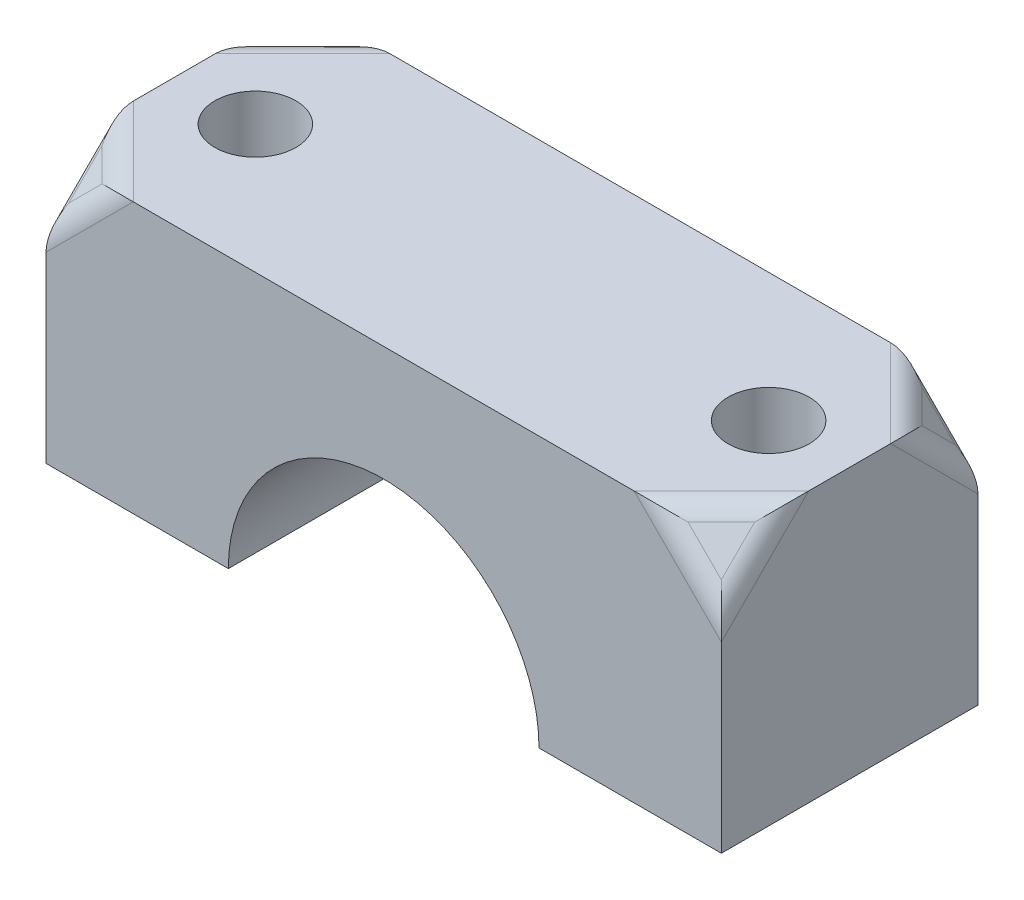
ISO-10303-21;
HEADER;
FILE_DESCRIPTION(('STEP AP214'),'2;1');
FILE_NAME('part.step','',(''),(''),'','','');
FILE_SCHEMA(('AUTOMOTIVE_DESIGN { 1 0 10303 214 1 1 1 1 }'));
ENDSEC;
DATA;
#1=APPLICATION_CONTEXT('core data for automotive mechanical design processes');
#2=APPLICATION_PROTOCOL_DEFINITION('international standard','automotive_design',2000,#1);
#3=PRODUCT_CONTEXT('',#1,'mechanical');
#4=PRODUCT('Part','Part','',(#3));
#5=PRODUCT_RELATED_PRODUCT_CATEGORY('part','',(#4));
#6=PRODUCT_DEFINITION_FORMATION('','',#4);
#7=PRODUCT_DEFINITION_CONTEXT('part definition',#1,'design');
#8=PRODUCT_DEFINITION('design','',#6,#7);
#9=PRODUCT_DEFINITION_SHAPE('','',#8);
#10=(LENGTH_UNIT() NAMED_UNIT(*) SI_UNIT(.MILLI.,.METRE.));
#11=(NAMED_UNIT(*) PLANE_ANGLE_UNIT() SI_UNIT($,.RADIAN.));
#12=(NAMED_UNIT(*) SI_UNIT($,.STERADIAN.) SOLID_ANGLE_UNIT());
#13=UNCERTAINTY_MEASURE_WITH_UNIT(LENGTH_MEASURE(1.E-05),#10,'distance_accuracy_value','');
#14=(GEOMETRIC_REPRESENTATION_CONTEXT(3) GLOBAL_UNCERTAINTY_ASSIGNED_CONTEXT((#13)) GLOBAL_UNIT_ASSIGNED_CONTEXT((#10,
#11,#12)) REPRESENTATION_CONTEXT('',''));
#15=CARTESIAN_POINT('',(0.,0.,0.));
#16=DIRECTION('',(0.,0.,1.));
#17=DIRECTION('',(1.,0.,0.));
#18=AXIS2_PLACEMENT_3D('',#15,#16,#17);
#19=CARTESIAN_POINT('',(0.,20.,19.));
#20=DIRECTION('',(0.,1.,0.));
#21=DIRECTION('',(0.,0.,1.));
#22=AXIS2_PLACEMENT_3D('',#19,#20,#21);
#23=PLANE('',#22);
#24=CARTESIAN_POINT('',(-19.,20.,9.50000000000001));
#25=DIRECTION('',(0.,1.,0.));
#26=DIRECTION('',(0.,0.,1.));
#27=AXIS2_PLACEMENT_3D('',#24,#25,#26);
#28=CIRCLE('',#27,3.);
#29=CARTESIAN_POINT('',(-19.,20.,12.5));
#30=VERTEX_POINT('',#29);
#31=EDGE_CURVE('E631',#30,#30,#28,.T.);
#32=ORIENTED_EDGE('',*,*,#31,.F.);
#33=EDGE_LOOP('',(#32));
#34=FACE_BOUND('',#33,.T.);
#35=CARTESIAN_POINT('',(19.,20.,9.49999999999999));
#36=DIRECTION('',(0.,1.,0.));
#37=DIRECTION('',(0.,0.,1.));
#38=AXIS2_PLACEMENT_3D('',#35,#36,#37);
#39=CIRCLE('',#38,3.);
#40=CARTESIAN_POINT('',(19.,20.,12.5));
#41=VERTEX_POINT('',#40);
#42=EDGE_CURVE('E329',#41,#41,#39,.T.);
#43=ORIENTED_EDGE('',*,*,#42,.F.);
#44=EDGE_LOOP('',(#43));
#45=FACE_BOUND('',#44,.T.);
#46=DIRECTION('',(0.,0.,-1.));
#47=VECTOR('',#46,1.);
#48=CARTESIAN_POINT('',(25.,20.,19.));
#49=LINE('',#48,#47);
#50=CARTESIAN_POINT('',(25.,20.,12.5358983848622));
#51=VERTEX_POINT('',#50);
#52=CARTESIAN_POINT('',(25.,20.,6.46410161513775));
#53=VERTEX_POINT('',#52);
#54=EDGE_CURVE('E239',#51,#53,#49,.T.);
#55=ORIENTED_EDGE('',*,*,#54,.T.);
#56=DIRECTION('',(-0.707106781186548,0.,-0.707106781186547));
#57=VECTOR('',#56,1.);
#58=CARTESIAN_POINT('',(18.7679491924311,20.,0.232050807568867));
#59=LINE('',#58,#57);
#60=CARTESIAN_POINT('',(18.5358983848623,20.,0.));
#61=VERTEX_POINT('',#60);
#62=EDGE_CURVE('E278',#53,#61,#59,.T.);
#63=ORIENTED_EDGE('',*,*,#62,.T.);
#64=DIRECTION('',(1.,0.,0.));
#65=VECTOR('',#64,1.);
#66=CARTESIAN_POINT('',(0.,20.,0.));
#67=LINE('',#66,#65);
#68=CARTESIAN_POINT('',(-18.5358983848623,20.,0.));
#69=VERTEX_POINT('',#68);
#70=EDGE_CURVE('E223',#69,#61,#67,.T.);
#71=ORIENTED_EDGE('',*,*,#70,.F.);
#72=DIRECTION('',(-0.707106781186548,0.,0.707106781186547));
#73=VECTOR('',#72,1.);
#74=CARTESIAN_POINT('',(-18.7679491924311,20.,0.23205080756887));
#75=LINE('',#74,#73);
#76=CARTESIAN_POINT('',(-25.,20.,6.46410161513775));
#77=VERTEX_POINT('',#76);
#78=EDGE_CURVE('E272',#69,#77,#75,.T.);
#79=ORIENTED_EDGE('',*,*,#78,.T.);
#80=DIRECTION('',(0.,0.,-1.));
#81=VECTOR('',#80,1.);
#82=CARTESIAN_POINT('',(-25.,20.,19.));
#83=LINE('',#82,#81);
#84=CARTESIAN_POINT('',(-25.,20.,12.5358983848622));
#85=VERTEX_POINT('',#84);
#86=EDGE_CURVE('E235',#85,#77,#83,.T.);
#87=ORIENTED_EDGE('',*,*,#86,.F.);
#88=DIRECTION('',(0.707106781186548,0.,0.707106781186548));
#89=VECTOR('',#88,1.);
#90=CARTESIAN_POINT('',(-9.26794919243112,20.,28.2679491924311));
#91=LINE('',#90,#89);
#92=CARTESIAN_POINT('',(-18.5358983848622,20.,19.));
#93=VERTEX_POINT('',#92);
#94=EDGE_CURVE('E269',#85,#93,#91,.T.);
#95=ORIENTED_EDGE('',*,*,#94,.T.);
#96=DIRECTION('',(1.,0.,0.));
#97=VECTOR('',#96,1.);
#98=CARTESIAN_POINT('',(0.,20.,19.));
#99=LINE('',#98,#97);
#100=CARTESIAN_POINT('',(18.5358983848622,20.,19.));
#101=VERTEX_POINT('',#100);
#102=EDGE_CURVE('E202',#93,#101,#99,.T.);
#103=ORIENTED_EDGE('',*,*,#102,.T.);
#104=DIRECTION('',(0.707106781186548,0.,-0.707106781186548));
#105=VECTOR('',#104,1.);
#106=CARTESIAN_POINT('',(9.26794919243112,20.,28.2679491924311));
#107=LINE('',#106,#105);
#108=EDGE_CURVE('E275',#101,#51,#107,.T.);
#109=ORIENTED_EDGE('',*,*,#108,.T.);
#110=EDGE_LOOP('',(#55,#63,#71,#79,#87,#95,#103,#109));
#111=FACE_BOUND('',#110,.T.);
#112=ADVANCED_FACE('F47',(#34,#45,#111),#23,.T.);
#113=CARTESIAN_POINT('',(0.,0.,19.));
#114=DIRECTION('',(0.,0.,1.));
#115=DIRECTION('',(1.,0.,0.));
#116=AXIS2_PLACEMENT_3D('',#113,#114,#115);
#117=PLANE('',#116);
#118=DIRECTION('',(0.,1.,0.));
#119=VECTOR('',#118,1.);
#120=CARTESIAN_POINT('',(25.,0.,19.));
#121=LINE('',#120,#119);
#122=CARTESIAN_POINT('',(25.,0.,19.));
#123=VERTEX_POINT('',#122);
#124=CARTESIAN_POINT('',(25.,13.5358983848622,19.));
#125=VERTEX_POINT('',#124);
#126=EDGE_CURVE('E182',#123,#125,#121,.T.);
#127=ORIENTED_EDGE('',*,*,#126,.T.);
#128=DIRECTION('',(-0.707106781186548,0.707106781186548,0.));
#129=VECTOR('',#128,1.);
#130=CARTESIAN_POINT('',(19.2679491924311,19.2679491924311,19.));
#131=LINE('',#130,#129);
#132=EDGE_CURVE('E295',#125,#101,#131,.T.);
#133=ORIENTED_EDGE('',*,*,#132,.T.);
#134=ORIENTED_EDGE('',*,*,#102,.F.);
#135=DIRECTION('',(-0.707106781186548,-0.707106781186548,0.));
#136=VECTOR('',#135,1.);
#137=CARTESIAN_POINT('',(-19.2679491924311,19.2679491924311,19.));
#138=LINE('',#137,#136);
#139=CARTESIAN_POINT('',(-25.,13.5358983848622,19.));
#140=VERTEX_POINT('',#139);
#141=EDGE_CURVE('E291',#93,#140,#138,.T.);
#142=ORIENTED_EDGE('',*,*,#141,.T.);
#143=DIRECTION('',(0.,1.,0.));
#144=VECTOR('',#143,1.);
#145=CARTESIAN_POINT('',(-25.,0.,19.));
#146=LINE('',#145,#144);
#147=CARTESIAN_POINT('',(-25.,0.,19.));
#148=VERTEX_POINT('',#147);
#149=EDGE_CURVE('E206',#148,#140,#146,.T.);
#150=ORIENTED_EDGE('',*,*,#149,.F.);
#151=DIRECTION('',(1.,0.,0.));
#152=VECTOR('',#151,1.);
#153=CARTESIAN_POINT('',(0.,0.,19.));
#154=LINE('',#153,#152);
#155=CARTESIAN_POINT('',(-11.5,0.,19.));
#156=VERTEX_POINT('',#155);
#157=EDGE_CURVE('E187',#148,#156,#154,.T.);
#158=ORIENTED_EDGE('',*,*,#157,.T.);
#159=CARTESIAN_POINT('',(0.,0.,19.));
#160=DIRECTION('',(0.,0.,1.));
#161=DIRECTION('',(1.,0.,0.));
#162=AXIS2_PLACEMENT_3D('',#159,#160,#161);
#163=CIRCLE('',#162,11.5);
#164=CARTESIAN_POINT('',(11.5,0.,19.));
#165=VERTEX_POINT('',#164);
#166=EDGE_CURVE('E165',#165,#156,#163,.T.);
#167=ORIENTED_EDGE('',*,*,#166,.F.);
#168=DIRECTION('',(1.,0.,0.));
#169=VECTOR('',#168,1.);
#170=CARTESIAN_POINT('',(0.,0.,19.));
#171=LINE('',#170,#169);
#172=EDGE_CURVE('E175',#165,#123,#171,.T.);
#173=ORIENTED_EDGE('',*,*,#172,.T.);
#174=EDGE_LOOP('',(#127,#133,#134,#142,#150,#158,#167,#173));
#175=FACE_BOUND('',#174,.T.);
#176=ADVANCED_FACE('F184',(#175),#117,.T.);
#177=CARTESIAN_POINT('',(-25.,0.,19.));
#178=DIRECTION('',(-1.,0.,0.));
#179=DIRECTION('',(0.,0.,1.));
#180=AXIS2_PLACEMENT_3D('',#177,#178,#179);
#181=PLANE('',#180);
#182=ORIENTED_EDGE('',*,*,#86,.T.);
#183=DIRECTION('',(0.,-0.707106781186548,-0.707106781186547));
#184=VECTOR('',#183,1.);
#185=CARTESIAN_POINT('',(-25.,16.2679491924311,2.73205080756887));
#186=LINE('',#185,#184);
#187=CARTESIAN_POINT('',(-25.,13.5358983848623,0.));
#188=VERTEX_POINT('',#187);
#189=EDGE_CURVE('E311',#77,#188,#186,.T.);
#190=ORIENTED_EDGE('',*,*,#189,.T.);
#191=DIRECTION('',(0.,1.,0.));
#192=VECTOR('',#191,1.);
#193=CARTESIAN_POINT('',(-25.,0.,0.));
#194=LINE('',#193,#192);
#195=CARTESIAN_POINT('',(-25.,0.,0.));
#196=VERTEX_POINT('',#195);
#197=EDGE_CURVE('E194',#196,#188,#194,.T.);
#198=ORIENTED_EDGE('',*,*,#197,.F.);
#199=DIRECTION('',(0.,0.,-1.));
#200=VECTOR('',#199,1.);
#201=CARTESIAN_POINT('',(-25.,0.,19.));
#202=LINE('',#201,#200);
#203=EDGE_CURVE('E232',#148,#196,#202,.T.);
#204=ORIENTED_EDGE('',*,*,#203,.F.);
#205=ORIENTED_EDGE('',*,*,#149,.T.);
#206=DIRECTION('',(0.,0.707106781186548,-0.707106781186548));
#207=VECTOR('',#206,1.);
#208=CARTESIAN_POINT('',(-25.,6.76794919243112,25.7679491924311));
#209=LINE('',#208,#207);
#210=EDGE_CURVE('E308',#140,#85,#209,.T.);
#211=ORIENTED_EDGE('',*,*,#210,.T.);
#212=EDGE_LOOP('',(#182,#190,#198,#204,#205,#211));
#213=FACE_BOUND('',#212,.T.);
#214=ADVANCED_FACE('F408',(#213),#181,.T.);
#215=CARTESIAN_POINT('',(0.,0.,19.));
#216=DIRECTION('',(0.,0.,-1.));
#217=DIRECTION('',(-1.,0.,0.));
#218=AXIS2_PLACEMENT_3D('',#215,#216,#217);
#219=CYLINDRICAL_SURFACE('',#218,11.5);
#220=CARTESIAN_POINT('',(0.,0.,0.));
#221=DIRECTION('',(0.,0.,1.));
#222=DIRECTION('',(1.,0.,0.));
#223=AXIS2_PLACEMENT_3D('',#220,#221,#222);
#224=CIRCLE('',#223,11.5);
#225=CARTESIAN_POINT('',(11.5,0.,0.));
#226=VERTEX_POINT('',#225);
#227=CARTESIAN_POINT('',(-11.5,0.,0.));
#228=VERTEX_POINT('',#227);
#229=EDGE_CURVE('E167',#226,#228,#224,.T.);
#230=ORIENTED_EDGE('',*,*,#229,.F.);
#231=DIRECTION('',(0.,0.,-1.));
#232=VECTOR('',#231,1.);
#233=CARTESIAN_POINT('',(11.5,0.,19.));
#234=LINE('',#233,#232);
#235=EDGE_CURVE('E161',#165,#226,#234,.T.);
#236=ORIENTED_EDGE('',*,*,#235,.F.);
#237=ORIENTED_EDGE('',*,*,#166,.T.);
#238=DIRECTION('',(0.,0.,-1.));
#239=VECTOR('',#238,1.);
#240=CARTESIAN_POINT('',(-11.5,0.,19.));
#241=LINE('',#240,#239);
#242=EDGE_CURVE('E212',#156,#228,#241,.T.);
#243=ORIENTED_EDGE('',*,*,#242,.T.);
#244=EDGE_LOOP('',(#230,#236,#237,#243));
#245=FACE_BOUND('',#244,.T.);
#246=ADVANCED_FACE('F163',(#245),#219,.F.);
#247=CARTESIAN_POINT('',(0.,0.,19.));
#248=DIRECTION('',(0.,1.,0.));
#249=DIRECTION('',(-1.,0.,0.));
#250=AXIS2_PLACEMENT_3D('',#247,#248,#249);
#251=PLANE('',#250);
#252=CARTESIAN_POINT('',(19.,0.,9.49999999999999));
#253=DIRECTION('',(0.,1.,0.));
#254=DIRECTION('',(0.,0.,1.));
#255=AXIS2_PLACEMENT_3D('',#252,#253,#254);
#256=CIRCLE('',#255,3.);
#257=CARTESIAN_POINT('',(19.,0.,12.5));
#258=VERTEX_POINT('',#257);
#259=EDGE_CURVE('E197',#258,#258,#256,.F.);
#260=ORIENTED_EDGE('',*,*,#259,.F.);
#261=EDGE_LOOP('',(#260));
#262=FACE_BOUND('',#261,.T.);
#263=DIRECTION('',(1.,0.,0.));
#264=VECTOR('',#263,1.);
#265=CARTESIAN_POINT('',(0.,0.,0.));
#266=LINE('',#265,#264);
#267=CARTESIAN_POINT('',(25.,0.,0.));
#268=VERTEX_POINT('',#267);
#269=EDGE_CURVE('E215',#226,#268,#266,.T.);
#270=ORIENTED_EDGE('',*,*,#269,.T.);
#271=DIRECTION('',(0.,0.,-1.));
#272=VECTOR('',#271,1.);
#273=CARTESIAN_POINT('',(25.,0.,19.));
#274=LINE('',#273,#272);
#275=EDGE_CURVE('E172',#123,#268,#274,.T.);
#276=ORIENTED_EDGE('',*,*,#275,.F.);
#277=ORIENTED_EDGE('',*,*,#172,.F.);
#278=ORIENTED_EDGE('',*,*,#235,.T.);
#279=EDGE_LOOP('',(#270,#276,#277,#278));
#280=FACE_BOUND('',#279,.T.);
#281=ADVANCED_FACE('F176',(#262,#280),#251,.F.);
#282=CARTESIAN_POINT('',(25.,0.,19.));
#283=DIRECTION('',(-1.,0.,0.));
#284=DIRECTION('',(0.,0.,1.));
#285=AXIS2_PLACEMENT_3D('',#282,#283,#284);
#286=PLANE('',#285);
#287=DIRECTION('',(0.,1.,0.));
#288=VECTOR('',#287,1.);
#289=CARTESIAN_POINT('',(25.,0.,0.));
#290=LINE('',#289,#288);
#291=CARTESIAN_POINT('',(25.,13.5358983848623,0.));
#292=VERTEX_POINT('',#291);
#293=EDGE_CURVE('E219',#268,#292,#290,.T.);
#294=ORIENTED_EDGE('',*,*,#293,.T.);
#295=DIRECTION('',(0.,-0.707106781186548,-0.707106781186547));
#296=VECTOR('',#295,1.);
#297=CARTESIAN_POINT('',(25.,19.2679491924311,5.73205080756887));
#298=LINE('',#297,#296);
#299=EDGE_CURVE('E266',#292,#53,#298,.F.);
#300=ORIENTED_EDGE('',*,*,#299,.T.);
#301=ORIENTED_EDGE('',*,*,#54,.F.);
#302=DIRECTION('',(0.,0.707106781186548,-0.707106781186548));
#303=VECTOR('',#302,1.);
#304=CARTESIAN_POINT('',(25.,14.2679491924311,18.2679491924311));
#305=LINE('',#304,#303);
#306=EDGE_CURVE('E262',#51,#125,#305,.F.);
#307=ORIENTED_EDGE('',*,*,#306,.T.);
#308=ORIENTED_EDGE('',*,*,#126,.F.);
#309=ORIENTED_EDGE('',*,*,#275,.T.);
#310=EDGE_LOOP('',(#294,#300,#301,#307,#308,#309));
#311=FACE_BOUND('',#310,.T.);
#312=ADVANCED_FACE('F378',(#311),#286,.F.);
#313=CARTESIAN_POINT('',(0.,0.,19.));
#314=DIRECTION('',(0.,1.,0.));
#315=DIRECTION('',(0.,0.,1.));
#316=AXIS2_PLACEMENT_3D('',#313,#314,#315);
#317=PLANE('',#316);
#318=CARTESIAN_POINT('',(-19.,0.,9.50000000000001));
#319=DIRECTION('',(0.,1.,0.));
#320=DIRECTION('',(0.,0.,1.));
#321=AXIS2_PLACEMENT_3D('',#318,#319,#320);
#322=CIRCLE('',#321,3.);
#323=CARTESIAN_POINT('',(-19.,0.,12.5));
#324=VERTEX_POINT('',#323);
#325=EDGE_CURVE('E216',#324,#324,#322,.F.);
#326=ORIENTED_EDGE('',*,*,#325,.F.);
#327=EDGE_LOOP('',(#326));
#328=FACE_BOUND('',#327,.T.);
#329=DIRECTION('',(1.,0.,0.));
#330=VECTOR('',#329,1.);
#331=CARTESIAN_POINT('',(0.,0.,0.));
#332=LINE('',#331,#330);
#333=EDGE_CURVE('E190',#196,#228,#332,.T.);
#334=ORIENTED_EDGE('',*,*,#333,.T.);
#335=ORIENTED_EDGE('',*,*,#242,.F.);
#336=ORIENTED_EDGE('',*,*,#157,.F.);
#337=ORIENTED_EDGE('',*,*,#203,.T.);
#338=EDGE_LOOP('',(#334,#335,#336,#337));
#339=FACE_BOUND('',#338,.T.);
#340=ADVANCED_FACE('F417',(#328,#339),#317,.F.);
#341=CARTESIAN_POINT('',(0.,0.,0.));
#342=DIRECTION('',(0.,0.,1.));
#343=DIRECTION('',(1.,0.,0.));
#344=AXIS2_PLACEMENT_3D('',#341,#342,#343);
#345=PLANE('',#344);
#346=ORIENTED_EDGE('',*,*,#70,.T.);
#347=DIRECTION('',(-0.707106781186548,0.707106781186548,0.));
#348=VECTOR('',#347,1.);
#349=CARTESIAN_POINT('',(24.2679491924311,14.2679491924311,0.));
#350=LINE('',#349,#348);
#351=EDGE_CURVE('E258',#61,#292,#350,.F.);
#352=ORIENTED_EDGE('',*,*,#351,.T.);
#353=ORIENTED_EDGE('',*,*,#293,.F.);
#354=ORIENTED_EDGE('',*,*,#269,.F.);
#355=ORIENTED_EDGE('',*,*,#229,.T.);
#356=ORIENTED_EDGE('',*,*,#333,.F.);
#357=ORIENTED_EDGE('',*,*,#197,.T.);
#358=DIRECTION('',(-0.707106781186548,-0.707106781186548,0.));
#359=VECTOR('',#358,1.);
#360=CARTESIAN_POINT('',(-19.2679491924311,19.2679491924311,0.));
#361=LINE('',#360,#359);
#362=EDGE_CURVE('E254',#188,#69,#361,.F.);
#363=ORIENTED_EDGE('',*,*,#362,.T.);
#364=EDGE_LOOP('',(#346,#352,#353,#354,#355,#356,#357,#363));
#365=FACE_BOUND('',#364,.T.);
#366=ADVANCED_FACE('F567',(#365),#345,.F.);
#367=CARTESIAN_POINT('',(-19.,-8.48528137423857,9.50000000000001));
#368=DIRECTION('',(0.,1.,0.));
#369=DIRECTION('',(0.,0.,1.));
#370=AXIS2_PLACEMENT_3D('',#367,#368,#369);
#371=CYLINDRICAL_SURFACE('',#370,3.);
#372=CARTESIAN_POINT('',(-19.,0.,12.5));
#373=CARTESIAN_POINT('',(-19.,0.208333333333332,12.5));
#374=CARTESIAN_POINT('',(-19.,0.416666666666665,12.5));
#375=CARTESIAN_POINT('',(-19.,0.833333333333332,12.5));
#376=CARTESIAN_POINT('',(-19.,1.04166666666667,12.5));
#377=CARTESIAN_POINT('',(-19.,1.45833333333333,12.5));
#378=CARTESIAN_POINT('',(-19.,1.66666666666667,12.5));
#379=CARTESIAN_POINT('',(-19.,2.08333333333333,12.5));
#380=CARTESIAN_POINT('',(-19.,2.29166666666667,12.5));
#381=CARTESIAN_POINT('',(-19.,2.70833333333333,12.5));
#382=CARTESIAN_POINT('',(-19.,2.91666666666667,12.5));
#383=CARTESIAN_POINT('',(-19.,3.33333333333333,12.5));
#384=CARTESIAN_POINT('',(-19.,3.54166666666667,12.5));
#385=CARTESIAN_POINT('',(-19.,3.95833333333333,12.5));
#386=CARTESIAN_POINT('',(-19.,4.16666666666667,12.5));
#387=CARTESIAN_POINT('',(-19.,4.58333333333333,12.5));
#388=CARTESIAN_POINT('',(-19.,4.79166666666667,12.5));
#389=CARTESIAN_POINT('',(-19.,5.20833333333333,12.5));
#390=CARTESIAN_POINT('',(-19.,5.41666666666667,12.5));
#391=CARTESIAN_POINT('',(-19.,5.83333333333333,12.5));
#392=CARTESIAN_POINT('',(-19.,6.04166666666667,12.5));
#393=CARTESIAN_POINT('',(-19.,6.45833333333333,12.5));
#394=CARTESIAN_POINT('',(-19.,6.66666666666667,12.5));
#395=CARTESIAN_POINT('',(-19.,7.08333333333333,12.5));
#396=CARTESIAN_POINT('',(-19.,7.29166666666666,12.5));
#397=CARTESIAN_POINT('',(-19.,7.70833333333333,12.5));
#398=CARTESIAN_POINT('',(-19.,7.91666666666666,12.5));
#399=CARTESIAN_POINT('',(-19.,8.33333333333333,12.5));
#400=CARTESIAN_POINT('',(-19.,8.54166666666666,12.5));
#401=CARTESIAN_POINT('',(-19.,8.95833333333333,12.5));
#402=CARTESIAN_POINT('',(-19.,9.16666666666666,12.5));
#403=CARTESIAN_POINT('',(-19.,9.58333333333333,12.5));
#404=CARTESIAN_POINT('',(-19.,9.79166666666667,12.5));
#405=CARTESIAN_POINT('',(-19.,10.2083333333333,12.5));
#406=CARTESIAN_POINT('',(-19.,10.4166666666667,12.5));
#407=CARTESIAN_POINT('',(-19.,10.8333333333333,12.5));
#408=CARTESIAN_POINT('',(-19.,11.0416666666667,12.5));
#409=CARTESIAN_POINT('',(-19.,11.4583333333333,12.5));
#410=CARTESIAN_POINT('',(-19.,11.6666666666667,12.5));
#411=CARTESIAN_POINT('',(-19.,12.0833333333333,12.5));
#412=CARTESIAN_POINT('',(-19.,12.2916666666667,12.5));
#413=CARTESIAN_POINT('',(-19.,12.7083333333333,12.5));
#414=CARTESIAN_POINT('',(-19.,12.9166666666667,12.5));
#415=CARTESIAN_POINT('',(-19.,13.3333333333333,12.5));
#416=CARTESIAN_POINT('',(-19.,13.5416666666667,12.5));
#417=CARTESIAN_POINT('',(-19.,13.9583333333333,12.5));
#418=CARTESIAN_POINT('',(-19.,14.1666666666667,12.5));
#419=CARTESIAN_POINT('',(-19.,14.5833333333333,12.5));
#420=CARTESIAN_POINT('',(-19.,14.7916666666667,12.5));
#421=CARTESIAN_POINT('',(-19.,15.2083333333333,12.5));
#422=CARTESIAN_POINT('',(-19.,15.4166666666667,12.5));
#423=CARTESIAN_POINT('',(-19.,15.8333333333333,12.5));
#424=CARTESIAN_POINT('',(-19.,16.0416666666667,12.5));
#425=CARTESIAN_POINT('',(-19.,16.4583333333333,12.5));
#426=CARTESIAN_POINT('',(-19.,16.6666666666667,12.5));
#427=CARTESIAN_POINT('',(-19.,17.0833333333333,12.5));
#428=CARTESIAN_POINT('',(-19.,17.2916666666667,12.5));
#429=CARTESIAN_POINT('',(-19.,17.7083333333333,12.5));
#430=CARTESIAN_POINT('',(-19.,17.9166666666667,12.5));
#431=CARTESIAN_POINT('',(-19.,18.3333333333333,12.5));
#432=CARTESIAN_POINT('',(-19.,18.5416666666667,12.5));
#433=CARTESIAN_POINT('',(-19.,18.9583333333333,12.5));
#434=CARTESIAN_POINT('',(-19.,19.1666666666667,12.5));
#435=CARTESIAN_POINT('',(-19.,19.5833333333333,12.5));
#436=CARTESIAN_POINT('',(-19.,19.7916666666667,12.5));
#437=CARTESIAN_POINT('',(-19.,20.,12.5));
#438=B_SPLINE_CURVE_WITH_KNOTS('',3,(#372,#373,#374,#375,#376,#377,#378,#379,#380,#381,#382,
#383,#384,#385,#386,#387,#388,#389,#390,#391,#392,#393,#394,#395,#396,#397,#398,#399,#400,#401,
#402,#403,#404,#405,#406,#407,#408,#409,#410,#411,#412,#413,#414,#415,#416,#417,#418,#419,#420,
#421,#422,#423,#424,#425,#426,#427,#428,#429,#430,#431,#432,#433,#434,#435,#436,#437),
.UNSPECIFIED.,.F.,.F.,(4,2,2,2,2,2,2,2,2,2,2,2,2,2,2,2,2,2,2,2,2,2,2,2,2,2,2,2,2,2,2,2,4),(0.,
0.625000000000001,1.25,1.875,2.5,3.125,3.75,4.375,5.,5.625,6.25,6.875,7.5,8.125,8.75,9.375,10.,
10.625,11.25,11.875,12.5,13.125,13.75,14.375,15.,15.625,16.25,16.875,17.5,18.125,18.75,19.375,
20.),.UNSPECIFIED.);
#439=EDGE_CURVE('BSEAM557',#324,#30,#438,.T.);
#440=ORIENTED_EDGE('',*,*,#325,.T.);
#441=ORIENTED_EDGE('',*,*,#31,.T.);
#442=ORIENTED_EDGE('',*,*,#439,.T.);
#443=ORIENTED_EDGE('',*,*,#439,.F.);
#444=EDGE_LOOP('',(#440,#442,#441,#443));
#445=FACE_BOUND('',#444,.T.);
#446=ADVANCED_FACE('F557',(#445),#371,.F.);
#447=CARTESIAN_POINT('',(19.,-8.48528137423857,9.49999999999999));
#448=DIRECTION('',(0.,1.,0.));
#449=DIRECTION('',(0.,0.,1.));
#450=AXIS2_PLACEMENT_3D('',#447,#448,#449);
#451=CYLINDRICAL_SURFACE('',#450,3.);
#452=CARTESIAN_POINT('',(19.,0.,12.5));
#453=CARTESIAN_POINT('',(19.,0.208333333333332,12.5));
#454=CARTESIAN_POINT('',(19.,0.416666666666665,12.5));
#455=CARTESIAN_POINT('',(19.,0.833333333333332,12.5));
#456=CARTESIAN_POINT('',(19.,1.04166666666667,12.5));
#457=CARTESIAN_POINT('',(19.,1.45833333333333,12.5));
#458=CARTESIAN_POINT('',(19.,1.66666666666667,12.5));
#459=CARTESIAN_POINT('',(19.,2.08333333333333,12.5));
#460=CARTESIAN_POINT('',(19.,2.29166666666667,12.5));
#461=CARTESIAN_POINT('',(19.,2.70833333333333,12.5));
#462=CARTESIAN_POINT('',(19.,2.91666666666667,12.5));
#463=CARTESIAN_POINT('',(19.,3.33333333333333,12.5));
#464=CARTESIAN_POINT('',(19.,3.54166666666667,12.5));
#465=CARTESIAN_POINT('',(19.,3.95833333333333,12.5));
#466=CARTESIAN_POINT('',(19.,4.16666666666667,12.5));
#467=CARTESIAN_POINT('',(19.,4.58333333333333,12.5));
#468=CARTESIAN_POINT('',(19.,4.79166666666667,12.5));
#469=CARTESIAN_POINT('',(19.,5.20833333333333,12.5));
#470=CARTESIAN_POINT('',(19.,5.41666666666667,12.5));
#471=CARTESIAN_POINT('',(19.,5.83333333333333,12.5));
#472=CARTESIAN_POINT('',(19.,6.04166666666667,12.5));
#473=CARTESIAN_POINT('',(19.,6.45833333333333,12.5));
#474=CARTESIAN_POINT('',(19.,6.66666666666667,12.5));
#475=CARTESIAN_POINT('',(19.,7.08333333333333,12.5));
#476=CARTESIAN_POINT('',(19.,7.29166666666666,12.5));
#477=CARTESIAN_POINT('',(19.,7.70833333333333,12.5));
#478=CARTESIAN_POINT('',(19.,7.91666666666666,12.5));
#479=CARTESIAN_POINT('',(19.,8.33333333333333,12.5));
#480=CARTESIAN_POINT('',(19.,8.54166666666666,12.5));
#481=CARTESIAN_POINT('',(19.,8.95833333333333,12.5));
#482=CARTESIAN_POINT('',(19.,9.16666666666666,12.5));
#483=CARTESIAN_POINT('',(19.,9.58333333333333,12.5));
#484=CARTESIAN_POINT('',(19.,9.79166666666667,12.5));
#485=CARTESIAN_POINT('',(19.,10.2083333333333,12.5));
#486=CARTESIAN_POINT('',(19.,10.4166666666667,12.5));
#487=CARTESIAN_POINT('',(19.,10.8333333333333,12.5));
#488=CARTESIAN_POINT('',(19.,11.0416666666667,12.5));
#489=CARTESIAN_POINT('',(19.,11.4583333333333,12.5));
#490=CARTESIAN_POINT('',(19.,11.6666666666667,12.5));
#491=CARTESIAN_POINT('',(19.,12.0833333333333,12.5));
#492=CARTESIAN_POINT('',(19.,12.2916666666667,12.5));
#493=CARTESIAN_POINT('',(19.,12.7083333333333,12.5));
#494=CARTESIAN_POINT('',(19.,12.9166666666667,12.5));
#495=CARTESIAN_POINT('',(19.,13.3333333333333,12.5));
#496=CARTESIAN_POINT('',(19.,13.5416666666667,12.5));
#497=CARTESIAN_POINT('',(19.,13.9583333333333,12.5));
#498=CARTESIAN_POINT('',(19.,14.1666666666667,12.5));
#499=CARTESIAN_POINT('',(19.,14.5833333333333,12.5));
#500=CARTESIAN_POINT('',(19.,14.7916666666667,12.5));
#501=CARTESIAN_POINT('',(19.,15.2083333333333,12.5));
#502=CARTESIAN_POINT('',(19.,15.4166666666667,12.5));
#503=CARTESIAN_POINT('',(19.,15.8333333333333,12.5));
#504=CARTESIAN_POINT('',(19.,16.0416666666667,12.5));
#505=CARTESIAN_POINT('',(19.,16.4583333333333,12.5));
#506=CARTESIAN_POINT('',(19.,16.6666666666667,12.5));
#507=CARTESIAN_POINT('',(19.,17.0833333333333,12.5));
#508=CARTESIAN_POINT('',(19.,17.2916666666667,12.5));
#509=CARTESIAN_POINT('',(19.,17.7083333333333,12.5));
#510=CARTESIAN_POINT('',(19.,17.9166666666667,12.5));
#511=CARTESIAN_POINT('',(19.,18.3333333333333,12.5));
#512=CARTESIAN_POINT('',(19.,18.5416666666667,12.5));
#513=CARTESIAN_POINT('',(19.,18.9583333333333,12.5));
#514=CARTESIAN_POINT('',(19.,19.1666666666667,12.5));
#515=CARTESIAN_POINT('',(19.,19.5833333333333,12.5));
#516=CARTESIAN_POINT('',(19.,19.7916666666667,12.5));
#517=CARTESIAN_POINT('',(19.,20.,12.5));
#518=B_SPLINE_CURVE_WITH_KNOTS('',3,(#452,#453,#454,#455,#456,#457,#458,#459,#460,#461,#462,
#463,#464,#465,#466,#467,#468,#469,#470,#471,#472,#473,#474,#475,#476,#477,#478,#479,#480,#481,
#482,#483,#484,#485,#486,#487,#488,#489,#490,#491,#492,#493,#494,#495,#496,#497,#498,#499,#500,
#501,#502,#503,#504,#505,#506,#507,#508,#509,#510,#511,#512,#513,#514,#515,#516,#517),
.UNSPECIFIED.,.F.,.F.,(4,2,2,2,2,2,2,2,2,2,2,2,2,2,2,2,2,2,2,2,2,2,2,2,2,2,2,2,2,2,2,2,4),(0.,
0.625000000000001,1.25,1.875,2.5,3.125,3.75,4.375,5.,5.625,6.25,6.875,7.5,8.125,8.75,9.375,10.,
10.625,11.25,11.875,12.5,13.125,13.75,14.375,15.,15.625,16.25,16.875,17.5,18.125,18.75,19.375,
20.),.UNSPECIFIED.);
#519=EDGE_CURVE('BSEAM548',#258,#41,#518,.T.);
#520=ORIENTED_EDGE('',*,*,#259,.T.);
#521=ORIENTED_EDGE('',*,*,#42,.T.);
#522=ORIENTED_EDGE('',*,*,#519,.T.);
#523=ORIENTED_EDGE('',*,*,#519,.F.);
#524=EDGE_LOOP('',(#520,#522,#521,#523));
#525=FACE_BOUND('',#524,.T.);
#526=ADVANCED_FACE('F548',(#525),#451,.F.);
#527=CARTESIAN_POINT('',(-19.6666666666667,19.6666666666667,19.6666666666667));
#528=DIRECTION('',(-0.577350269189626,0.577350269189626,0.577350269189626));
#529=DIRECTION('',(0.707106781186547,0.,0.707106781186547));
#530=AXIS2_PLACEMENT_3D('',#527,#528,#529);
#531=PLANE('',#530);
#532=DIRECTION('',(0.,0.707106781186548,-0.707106781186548));
#533=VECTOR('',#532,1.);
#534=CARTESIAN_POINT('',(-24.1547005383793,17.4226497308104,17.4226497308104));
#535=LINE('',#534,#533);
#536=CARTESIAN_POINT('',(-24.1547005383793,19.1547005383793,15.6905989232415));
#537=VERTEX_POINT('',#536);
#538=CARTESIAN_POINT('',(-24.1547005383793,16.6905989232415,18.1547005383793));
#539=VERTEX_POINT('',#538);
#540=EDGE_CURVE('E57',#537,#539,#535,.F.);
#541=ORIENTED_EDGE('',*,*,#540,.T.);
#542=DIRECTION('',(-0.707106781186548,-0.707106781186548,0.));
#543=VECTOR('',#542,1.);
#544=CARTESIAN_POINT('',(-20.4226497308104,20.4226497308104,18.1547005383793));
#545=LINE('',#544,#543);
#546=CARTESIAN_POINT('',(-21.6905989232415,19.1547005383793,18.1547005383793));
#547=VERTEX_POINT('',#546);
#548=EDGE_CURVE('E11',#539,#547,#545,.F.);
#549=ORIENTED_EDGE('',*,*,#548,.T.);
#550=DIRECTION('',(0.707106781186548,0.,0.707106781186548));
#551=VECTOR('',#550,1.);
#552=CARTESIAN_POINT('',(-19.9226497308104,19.1547005383793,19.9226497308104));
#553=LINE('',#552,#551);
#554=EDGE_CURVE('E67',#547,#537,#553,.F.);
#555=ORIENTED_EDGE('',*,*,#554,.T.);
#556=EDGE_LOOP('',(#541,#549,#555));
#557=FACE_BOUND('',#556,.T.);
#558=ADVANCED_FACE('F398',(#557),#531,.T.);
#559=CARTESIAN_POINT('',(-13.3333333333333,13.3333333333333,-13.3333333333333));
#560=DIRECTION('',(-0.577350269189626,0.577350269189626,-0.577350269189626));
#561=DIRECTION('',(-0.707106781186548,0.,0.707106781186547));
#562=AXIS2_PLACEMENT_3D('',#559,#560,#561);
#563=PLANE('',#562);
#564=DIRECTION('',(-0.707106781186548,0.,0.707106781186547));
#565=VECTOR('',#564,1.);
#566=CARTESIAN_POINT('',(-10.4226497308104,19.1547005383793,-10.4226497308104));
#567=LINE('',#566,#565);
#568=CARTESIAN_POINT('',(-24.1547005383792,19.1547005383793,3.30940107675849));
#569=VERTEX_POINT('',#568);
#570=CARTESIAN_POINT('',(-21.6905989232415,19.1547005383793,0.845299461620749));
#571=VERTEX_POINT('',#570);
#572=EDGE_CURVE('E301',#569,#571,#567,.F.);
#573=ORIENTED_EDGE('',*,*,#572,.T.);
#574=DIRECTION('',(-0.707106781186548,-0.707106781186548,0.));
#575=VECTOR('',#574,1.);
#576=CARTESIAN_POINT('',(-25.4226497308104,15.4226497308104,0.845299461620748));
#577=LINE('',#576,#575);
#578=CARTESIAN_POINT('',(-24.1547005383793,16.6905989232415,0.845299461620747));
#579=VERTEX_POINT('',#578);
#580=EDGE_CURVE('E304',#571,#579,#577,.T.);
#581=ORIENTED_EDGE('',*,*,#580,.T.);
#582=DIRECTION('',(0.,-0.707106781186548,-0.707106781186547));
#583=VECTOR('',#582,1.);
#584=CARTESIAN_POINT('',(-24.1547005383792,7.92264973081038,-7.92264973081038));
#585=LINE('',#584,#583);
#586=EDGE_CURVE('E298',#579,#569,#585,.F.);
#587=ORIENTED_EDGE('',*,*,#586,.T.);
#588=EDGE_LOOP('',(#573,#581,#587));
#589=FACE_BOUND('',#588,.T.);
#590=ADVANCED_FACE('F389',(#589),#563,.T.);
#591=CARTESIAN_POINT('',(19.6666666666667,19.6666666666667,19.6666666666667));
#592=DIRECTION('',(0.577350269189626,0.577350269189626,0.577350269189626));
#593=DIRECTION('',(0.707106781186547,0.,-0.707106781186547));
#594=AXIS2_PLACEMENT_3D('',#591,#592,#593);
#595=PLANE('',#594);
#596=DIRECTION('',(-0.707106781186548,0.707106781186548,0.));
#597=VECTOR('',#596,1.);
#598=CARTESIAN_POINT('',(20.4226497308104,20.4226497308104,18.1547005383793));
#599=LINE('',#598,#597);
#600=CARTESIAN_POINT('',(21.6905989232415,19.1547005383793,18.1547005383793));
#601=VERTEX_POINT('',#600);
#602=CARTESIAN_POINT('',(24.1547005383793,16.6905989232415,18.1547005383793));
#603=VERTEX_POINT('',#602);
#604=EDGE_CURVE('E284',#601,#603,#599,.F.);
#605=ORIENTED_EDGE('',*,*,#604,.T.);
#606=DIRECTION('',(0.,0.707106781186548,-0.707106781186548));
#607=VECTOR('',#606,1.);
#608=CARTESIAN_POINT('',(24.1547005383793,20.4226497308104,14.4226497308104));
#609=LINE('',#608,#607);
#610=CARTESIAN_POINT('',(24.1547005383793,19.1547005383793,15.6905989232415));
#611=VERTEX_POINT('',#610);
#612=EDGE_CURVE('E287',#603,#611,#609,.T.);
#613=ORIENTED_EDGE('',*,*,#612,.T.);
#614=DIRECTION('',(0.707106781186548,0.,-0.707106781186548));
#615=VECTOR('',#614,1.);
#616=CARTESIAN_POINT('',(19.9226497308104,19.1547005383793,19.9226497308104));
#617=LINE('',#616,#615);
#618=EDGE_CURVE('E281',#611,#601,#617,.F.);
#619=ORIENTED_EDGE('',*,*,#618,.T.);
#620=EDGE_LOOP('',(#605,#613,#619));
#621=FACE_BOUND('',#620,.T.);
#622=ADVANCED_FACE('F386',(#621),#595,.T.);
#623=CARTESIAN_POINT('',(13.3333333333333,13.3333333333333,-13.3333333333333));
#624=DIRECTION('',(0.577350269189626,0.577350269189626,-0.577350269189626));
#625=DIRECTION('',(-0.707106781186548,0.,-0.707106781186547));
#626=AXIS2_PLACEMENT_3D('',#623,#624,#625);
#627=PLANE('',#626);
#628=DIRECTION('',(0.,-0.707106781186548,-0.707106781186547));
#629=VECTOR('',#628,1.);
#630=CARTESIAN_POINT('',(24.1547005383793,15.4226497308104,-0.422649730810375));
#631=LINE('',#630,#629);
#632=CARTESIAN_POINT('',(24.1547005383793,19.1547005383793,3.3094010767585));
#633=VERTEX_POINT('',#632);
#634=CARTESIAN_POINT('',(24.1547005383793,16.6905989232415,0.845299461620748));
#635=VERTEX_POINT('',#634);
#636=EDGE_CURVE('E247',#633,#635,#631,.T.);
#637=ORIENTED_EDGE('',*,*,#636,.T.);
#638=DIRECTION('',(-0.707106781186548,0.707106781186548,0.));
#639=VECTOR('',#638,1.);
#640=CARTESIAN_POINT('',(20.4226497308104,20.4226497308104,0.845299461620748));
#641=LINE('',#640,#639);
#642=CARTESIAN_POINT('',(21.6905989232415,19.1547005383793,0.845299461620748));
#643=VERTEX_POINT('',#642);
#644=EDGE_CURVE('E250',#635,#643,#641,.T.);
#645=ORIENTED_EDGE('',*,*,#644,.T.);
#646=DIRECTION('',(-0.707106781186548,0.,-0.707106781186547));
#647=VECTOR('',#646,1.);
#648=CARTESIAN_POINT('',(10.4226497308104,19.1547005383793,-10.4226497308104));
#649=LINE('',#648,#647);
#650=EDGE_CURVE('E171',#643,#633,#649,.F.);
#651=ORIENTED_EDGE('',*,*,#650,.T.);
#652=EDGE_LOOP('',(#637,#645,#651));
#653=FACE_BOUND('',#652,.T.);
#654=ADVANCED_FACE('F388',(#653),#627,.T.);
#655=CARTESIAN_POINT('',(23.,6.76794919243112,-6.76794919243113));
#656=DIRECTION('',(0.,0.707106781186548,0.707106781186547));
#657=DIRECTION('',(0.,-0.707106781186547,0.707106781186548));
#658=AXIS2_PLACEMENT_3D('',#655,#656,#657);
#659=CYLINDRICAL_SURFACE('',#658,2.);
#660=CARTESIAN_POINT('',(23.,15.5358983848623,2.));
#661=DIRECTION('',(0.707106781186548,0.,0.707106781186548));
#662=DIRECTION('',(-0.408248290463863,0.816496580927726,0.408248290463863));
#663=AXIS2_PLACEMENT_3D('',#660,#661,#662);
#664=ELLIPSE('',#663,4.,2.);
#665=EDGE_CURVE('E321',#635,#292,#664,.F.);
#666=ORIENTED_EDGE('',*,*,#665,.F.);
#667=ORIENTED_EDGE('',*,*,#636,.F.);
#668=CARTESIAN_POINT('',(23.,18.,4.46410161513775));
#669=DIRECTION('',(-0.707106781186548,0.707106781186548,0.));
#670=DIRECTION('',(-0.408248290463863,-0.408248290463863,-0.816496580927726));
#671=AXIS2_PLACEMENT_3D('',#668,#669,#670);
#672=ELLIPSE('',#671,4.,2.);
#673=EDGE_CURVE('E325',#53,#633,#672,.T.);
#674=ORIENTED_EDGE('',*,*,#673,.F.);
#675=ORIENTED_EDGE('',*,*,#299,.F.);
#676=EDGE_LOOP('',(#666,#667,#674,#675));
#677=FACE_BOUND('',#676,.T.);
#678=ADVANCED_FACE('F395',(#677),#659,.T.);
#679=CARTESIAN_POINT('',(18.7679491924311,18.,0.23205080756887));
#680=DIRECTION('',(-0.707106781186548,0.,-0.707106781186547));
#681=DIRECTION('',(-0.707106781186547,0.,0.707106781186548));
#682=AXIS2_PLACEMENT_3D('',#679,#680,#681);
#683=CYLINDRICAL_SURFACE('',#682,2.);
#684=ORIENTED_EDGE('',*,*,#673,.T.);
#685=ORIENTED_EDGE('',*,*,#650,.F.);
#686=CARTESIAN_POINT('',(20.5358983848623,18.,2.));
#687=DIRECTION('',(0.,-0.707106781186548,-0.707106781186548));
#688=DIRECTION('',(-0.816496580927726,0.408248290463863,-0.408248290463863));
#689=AXIS2_PLACEMENT_3D('',#686,#687,#688);
#690=ELLIPSE('',#689,4.,2.);
#691=EDGE_CURVE('E318',#61,#643,#690,.T.);
#692=ORIENTED_EDGE('',*,*,#691,.F.);
#693=ORIENTED_EDGE('',*,*,#62,.F.);
#694=EDGE_LOOP('',(#684,#685,#692,#693));
#695=FACE_BOUND('',#694,.T.);
#696=ADVANCED_FACE('F426',(#695),#683,.T.);
#697=CARTESIAN_POINT('',(19.2679491924311,19.2679491924311,2.));
#698=DIRECTION('',(0.707106781186547,-0.707106781186547,0.));
#699=DIRECTION('',(0.707106781186548,0.707106781186548,0.));
#700=AXIS2_PLACEMENT_3D('',#697,#698,#699);
#701=CYLINDRICAL_SURFACE('',#700,2.);
#702=ORIENTED_EDGE('',*,*,#665,.T.);
#703=ORIENTED_EDGE('',*,*,#351,.F.);
#704=ORIENTED_EDGE('',*,*,#691,.T.);
#705=ORIENTED_EDGE('',*,*,#644,.F.);
#706=EDGE_LOOP('',(#702,#703,#704,#705));
#707=FACE_BOUND('',#706,.T.);
#708=ADVANCED_FACE('F423',(#707),#701,.T.);
#709=CARTESIAN_POINT('',(19.2679491924311,19.2679491924311,17.));
#710=DIRECTION('',(-0.707106781186547,0.707106781186547,0.));
#711=DIRECTION('',(-0.707106781186548,-0.707106781186548,0.));
#712=AXIS2_PLACEMENT_3D('',#709,#710,#711);
#713=CYLINDRICAL_SURFACE('',#712,2.);
#714=CARTESIAN_POINT('',(23.,15.5358983848622,17.));
#715=DIRECTION('',(-0.707106781186548,0.,0.707106781186548));
#716=DIRECTION('',(-0.408248290463863,0.816496580927726,-0.408248290463863));
#717=AXIS2_PLACEMENT_3D('',#714,#715,#716);
#718=ELLIPSE('',#717,4.,2.);
#719=EDGE_CURVE('E333',#603,#125,#718,.F.);
#720=ORIENTED_EDGE('',*,*,#719,.F.);
#721=ORIENTED_EDGE('',*,*,#604,.F.);
#722=CARTESIAN_POINT('',(20.5358983848622,18.,17.));
#723=DIRECTION('',(0.,0.707106781186548,-0.707106781186548));
#724=DIRECTION('',(0.816496580927726,-0.408248290463863,-0.408248290463863));
#725=AXIS2_PLACEMENT_3D('',#722,#723,#724);
#726=ELLIPSE('',#725,4.,2.);
#727=EDGE_CURVE('E322',#101,#601,#726,.T.);
#728=ORIENTED_EDGE('',*,*,#727,.F.);
#729=ORIENTED_EDGE('',*,*,#132,.F.);
#730=EDGE_LOOP('',(#720,#721,#728,#729));
#731=FACE_BOUND('',#730,.T.);
#732=ADVANCED_FACE('F371',(#731),#713,.T.);
#733=CARTESIAN_POINT('',(9.26794919243112,18.,28.2679491924311));
#734=DIRECTION('',(0.707106781186547,0.,-0.707106781186547));
#735=DIRECTION('',(-0.707106781186548,0.,-0.707106781186548));
#736=AXIS2_PLACEMENT_3D('',#733,#734,#735);
#737=CYLINDRICAL_SURFACE('',#736,2.);
#738=ORIENTED_EDGE('',*,*,#727,.T.);
#739=ORIENTED_EDGE('',*,*,#618,.F.);
#740=CARTESIAN_POINT('',(23.,18.,14.5358983848622));
#741=DIRECTION('',(0.707106781186548,-0.707106781186548,0.));
#742=DIRECTION('',(0.408248290463863,0.408248290463863,-0.816496580927726));
#743=AXIS2_PLACEMENT_3D('',#740,#741,#742);
#744=ELLIPSE('',#743,4.,2.);
#745=EDGE_CURVE('E330',#51,#611,#744,.T.);
#746=ORIENTED_EDGE('',*,*,#745,.F.);
#747=ORIENTED_EDGE('',*,*,#108,.F.);
#748=EDGE_LOOP('',(#738,#739,#746,#747));
#749=FACE_BOUND('',#748,.T.);
#750=ADVANCED_FACE('F384',(#749),#737,.T.);
#751=CARTESIAN_POINT('',(23.,16.2679491924311,16.2679491924311));
#752=DIRECTION('',(0.,-0.707106781186547,0.707106781186547));
#753=DIRECTION('',(0.,-0.707106781186548,-0.707106781186548));
#754=AXIS2_PLACEMENT_3D('',#751,#752,#753);
#755=CYLINDRICAL_SURFACE('',#754,2.);
#756=ORIENTED_EDGE('',*,*,#719,.T.);
#757=ORIENTED_EDGE('',*,*,#306,.F.);
#758=ORIENTED_EDGE('',*,*,#745,.T.);
#759=ORIENTED_EDGE('',*,*,#612,.F.);
#760=EDGE_LOOP('',(#756,#757,#758,#759));
#761=FACE_BOUND('',#760,.T.);
#762=ADVANCED_FACE('F381',(#761),#755,.T.);
#763=CARTESIAN_POINT('',(-18.7679491924311,18.,0.23205080756887));
#764=DIRECTION('',(-0.707106781186548,0.,0.707106781186547));
#765=DIRECTION('',(0.707106781186547,0.,0.707106781186548));
#766=AXIS2_PLACEMENT_3D('',#763,#764,#765);
#767=CYLINDRICAL_SURFACE('',#766,2.);
#768=CARTESIAN_POINT('',(-20.5358983848623,18.,2.));
#769=DIRECTION('',(0.,0.707106781186548,0.707106781186548));
#770=DIRECTION('',(-0.816496580927726,-0.408248290463863,0.408248290463863));
#771=AXIS2_PLACEMENT_3D('',#768,#769,#770);
#772=ELLIPSE('',#771,4.,2.);
#773=EDGE_CURVE('E343',#571,#69,#772,.F.);
#774=ORIENTED_EDGE('',*,*,#773,.F.);
#775=ORIENTED_EDGE('',*,*,#572,.F.);
#776=CARTESIAN_POINT('',(-23.,18.,4.46410161513775));
#777=DIRECTION('',(-0.707106781186548,-0.707106781186548,0.));
#778=DIRECTION('',(0.408248290463863,-0.408248290463863,-0.816496580927726));
#779=AXIS2_PLACEMENT_3D('',#776,#777,#778);
#780=ELLIPSE('',#779,4.,2.);
#781=EDGE_CURVE('E334',#77,#569,#780,.T.);
#782=ORIENTED_EDGE('',*,*,#781,.F.);
#783=ORIENTED_EDGE('',*,*,#78,.F.);
#784=EDGE_LOOP('',(#774,#775,#782,#783));
#785=FACE_BOUND('',#784,.T.);
#786=ADVANCED_FACE('F436',(#785),#767,.T.);
#787=CARTESIAN_POINT('',(-23.,16.2679491924311,2.73205080756887));
#788=DIRECTION('',(0.,-0.707106781186548,-0.707106781186547));
#789=DIRECTION('',(0.,0.707106781186547,-0.707106781186548));
#790=AXIS2_PLACEMENT_3D('',#787,#788,#789);
#791=CYLINDRICAL_SURFACE('',#790,2.);
#792=ORIENTED_EDGE('',*,*,#781,.T.);
#793=ORIENTED_EDGE('',*,*,#586,.F.);
#794=CARTESIAN_POINT('',(-23.,15.5358983848623,2.));
#795=DIRECTION('',(0.707106781186548,0.,-0.707106781186548));
#796=DIRECTION('',(-0.408248290463863,-0.816496580927726,-0.408248290463863));
#797=AXIS2_PLACEMENT_3D('',#794,#795,#796);
#798=ELLIPSE('',#797,4.,2.);
#799=EDGE_CURVE('E340',#188,#579,#798,.T.);
#800=ORIENTED_EDGE('',*,*,#799,.F.);
#801=ORIENTED_EDGE('',*,*,#189,.F.);
#802=EDGE_LOOP('',(#792,#793,#800,#801));
#803=FACE_BOUND('',#802,.T.);
#804=ADVANCED_FACE('F444',(#803),#791,.T.);
#805=CARTESIAN_POINT('',(-19.2679491924311,19.2679491924311,2.));
#806=DIRECTION('',(0.707106781186547,0.707106781186547,0.));
#807=DIRECTION('',(-0.707106781186548,0.707106781186548,0.));
#808=AXIS2_PLACEMENT_3D('',#805,#806,#807);
#809=CYLINDRICAL_SURFACE('',#808,2.);
#810=ORIENTED_EDGE('',*,*,#773,.T.);
#811=ORIENTED_EDGE('',*,*,#362,.F.);
#812=ORIENTED_EDGE('',*,*,#799,.T.);
#813=ORIENTED_EDGE('',*,*,#580,.F.);
#814=EDGE_LOOP('',(#810,#811,#812,#813));
#815=FACE_BOUND('',#814,.T.);
#816=ADVANCED_FACE('F441',(#815),#809,.T.);
#817=CARTESIAN_POINT('',(-9.26794919243112,18.,28.2679491924311));
#818=DIRECTION('',(0.707106781186547,0.,0.707106781186547));
#819=DIRECTION('',(0.707106781186548,0.,-0.707106781186548));
#820=AXIS2_PLACEMENT_3D('',#817,#818,#819);
#821=CYLINDRICAL_SURFACE('',#820,2.);
#822=CARTESIAN_POINT('',(-20.5358983848622,18.,17.));
#823=DIRECTION('',(0.,-0.707106781186548,0.707106781186548));
#824=DIRECTION('',(0.816496580927726,0.408248290463863,0.408248290463863));
#825=AXIS2_PLACEMENT_3D('',#822,#823,#824);
#826=ELLIPSE('',#825,4.,2.);
#827=EDGE_CURVE('E351',#93,#547,#826,.T.);
#828=ORIENTED_EDGE('',*,*,#827,.F.);
#829=ORIENTED_EDGE('',*,*,#94,.F.);
#830=CARTESIAN_POINT('',(-23.,18.,14.5358983848622));
#831=DIRECTION('',(0.707106781186548,0.707106781186548,0.));
#832=DIRECTION('',(0.408248290463863,-0.408248290463863,0.816496580927726));
#833=AXIS2_PLACEMENT_3D('',#830,#831,#832);
#834=ELLIPSE('',#833,4.,2.);
#835=EDGE_CURVE('E51',#537,#85,#834,.F.);
#836=ORIENTED_EDGE('',*,*,#835,.F.);
#837=ORIENTED_EDGE('',*,*,#554,.F.);
#838=EDGE_LOOP('',(#828,#829,#836,#837));
#839=FACE_BOUND('',#838,.T.);
#840=ADVANCED_FACE('F49',(#839),#821,.T.);
#841=CARTESIAN_POINT('',(-23.,6.76794919243112,25.7679491924311));
#842=DIRECTION('',(0.,0.707106781186547,-0.707106781186547));
#843=DIRECTION('',(0.,0.707106781186548,0.707106781186548));
#844=AXIS2_PLACEMENT_3D('',#841,#842,#843);
#845=CYLINDRICAL_SURFACE('',#844,2.);
#846=ORIENTED_EDGE('',*,*,#835,.T.);
#847=ORIENTED_EDGE('',*,*,#210,.F.);
#848=CARTESIAN_POINT('',(-23.,15.5358983848622,17.));
#849=DIRECTION('',(-0.707106781186548,0.,-0.707106781186548));
#850=DIRECTION('',(0.408248290463863,0.816496580927726,-0.408248290463863));
#851=AXIS2_PLACEMENT_3D('',#848,#849,#850);
#852=ELLIPSE('',#851,4.,2.);
#853=EDGE_CURVE('E349',#539,#140,#852,.F.);
#854=ORIENTED_EDGE('',*,*,#853,.F.);
#855=ORIENTED_EDGE('',*,*,#540,.F.);
#856=EDGE_LOOP('',(#846,#847,#854,#855));
#857=FACE_BOUND('',#856,.T.);
#858=ADVANCED_FACE('F360',(#857),#845,.T.);
#859=CARTESIAN_POINT('',(-19.2679491924311,19.2679491924311,17.));
#860=DIRECTION('',(-0.707106781186547,-0.707106781186547,0.));
#861=DIRECTION('',(0.707106781186548,-0.707106781186548,0.));
#862=AXIS2_PLACEMENT_3D('',#859,#860,#861);
#863=CYLINDRICAL_SURFACE('',#862,2.);
#864=ORIENTED_EDGE('',*,*,#827,.T.);
#865=ORIENTED_EDGE('',*,*,#548,.F.);
#866=ORIENTED_EDGE('',*,*,#853,.T.);
#867=ORIENTED_EDGE('',*,*,#141,.F.);
#868=EDGE_LOOP('',(#864,#865,#866,#867));
#869=FACE_BOUND('',#868,.T.);
#870=ADVANCED_FACE('F452',(#869),#863,.T.);
#871=CLOSED_SHELL('',(#112,#176,#214,#246,#281,#312,#340,#366,#446,#526,#558,#590,#622,#654,
#678,#696,#708,#732,#750,#762,#786,#804,#816,#840,#858,#870));
#872=MANIFOLD_SOLID_BREP('B2',#871);
#873=ADVANCED_BREP_SHAPE_REPRESENTATION('',(#18,#872),#14);
#874=SHAPE_DEFINITION_REPRESENTATION(#9,#873);
ENDSEC;
END-ISO-10303-21;
